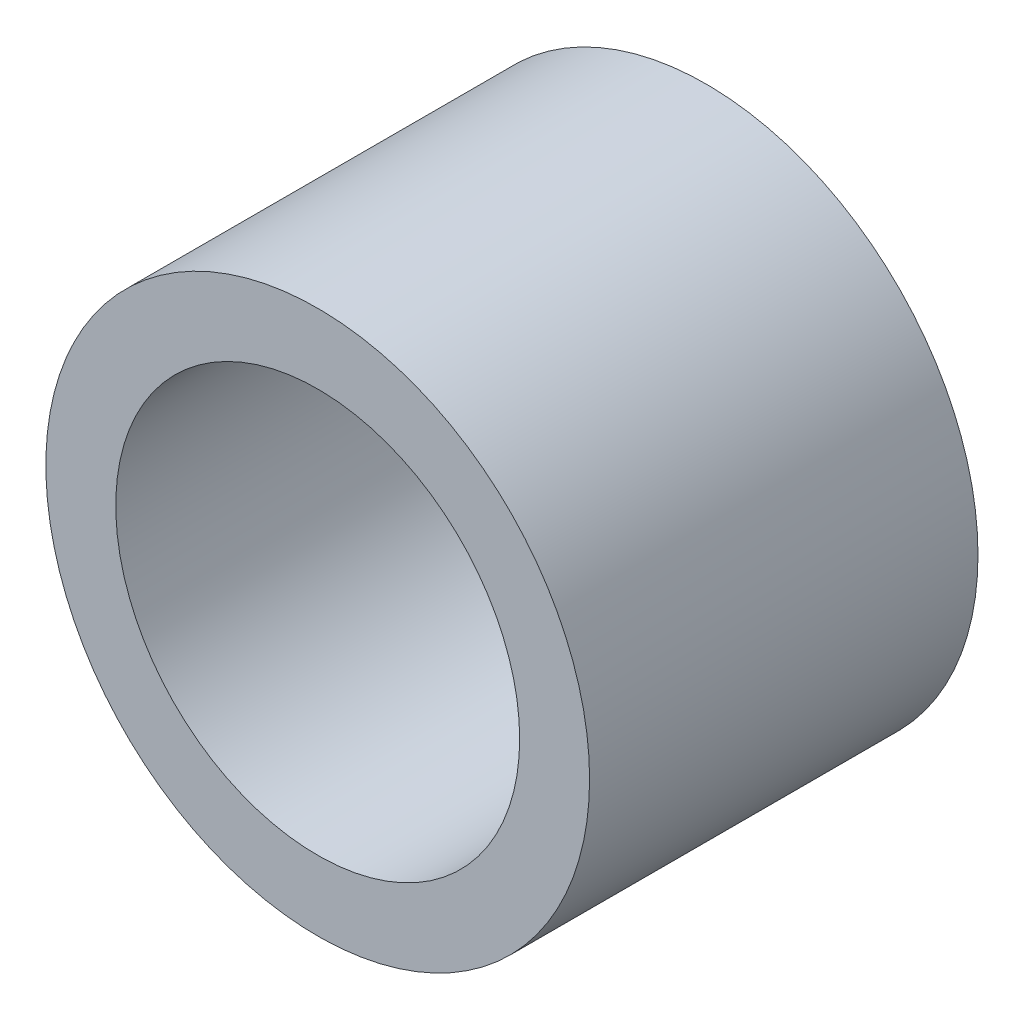
ISO-10303-21;
HEADER;
FILE_DESCRIPTION(('STEP AP214'),'2;1');
FILE_NAME('part.step','',(''),(''),'','','');
FILE_SCHEMA(('AUTOMOTIVE_DESIGN { 1 0 10303 214 1 1 1 1 }'));
ENDSEC;
DATA;
#1=APPLICATION_CONTEXT('core data for automotive mechanical design processes');
#2=APPLICATION_PROTOCOL_DEFINITION('international standard','automotive_design',2000,#1);
#3=PRODUCT_CONTEXT('',#1,'mechanical');
#4=PRODUCT('Part','Part','',(#3));
#5=PRODUCT_RELATED_PRODUCT_CATEGORY('part','',(#4));
#6=PRODUCT_DEFINITION_FORMATION('','',#4);
#7=PRODUCT_DEFINITION_CONTEXT('part definition',#1,'design');
#8=PRODUCT_DEFINITION('design','',#6,#7);
#9=PRODUCT_DEFINITION_SHAPE('','',#8);
#10=(LENGTH_UNIT() NAMED_UNIT(*) SI_UNIT(.MILLI.,.METRE.));
#11=(NAMED_UNIT(*) PLANE_ANGLE_UNIT() SI_UNIT($,.RADIAN.));
#12=(NAMED_UNIT(*) SI_UNIT($,.STERADIAN.) SOLID_ANGLE_UNIT());
#13=UNCERTAINTY_MEASURE_WITH_UNIT(LENGTH_MEASURE(1.E-05),#10,'distance_accuracy_value','');
#14=(GEOMETRIC_REPRESENTATION_CONTEXT(3) GLOBAL_UNCERTAINTY_ASSIGNED_CONTEXT((#13)) GLOBAL_UNIT_ASSIGNED_CONTEXT((#10,
#11,#12)) REPRESENTATION_CONTEXT('',''));
#15=CARTESIAN_POINT('',(0.,0.,0.));
#16=DIRECTION('',(0.,0.,1.));
#17=DIRECTION('',(1.,0.,0.));
#18=AXIS2_PLACEMENT_3D('',#15,#16,#17);
#19=CARTESIAN_POINT('',(0.,0.,10.));
#20=DIRECTION('',(0.,0.,1.));
#21=DIRECTION('',(1.,0.,0.));
#22=AXIS2_PLACEMENT_3D('',#19,#20,#21);
#23=PLANE('',#22);
#24=CARTESIAN_POINT('',(0.,0.,10.));
#25=DIRECTION('',(0.,0.,1.));
#26=DIRECTION('',(1.,0.,0.));
#27=AXIS2_PLACEMENT_3D('',#24,#25,#26);
#28=CIRCLE('',#27,7.);
#29=CARTESIAN_POINT('',(7.,0.,10.));
#30=VERTEX_POINT('',#29);
#31=EDGE_CURVE('E10',#30,#30,#28,.T.);
#32=ORIENTED_EDGE('',*,*,#31,.T.);
#33=EDGE_LOOP('',(#32));
#34=FACE_BOUND('',#33,.T.);
#35=CARTESIAN_POINT('',(0.,0.,10.));
#36=DIRECTION('',(0.,0.,1.));
#37=DIRECTION('',(1.,0.,0.));
#38=AXIS2_PLACEMENT_3D('',#35,#36,#37);
#39=CIRCLE('',#38,5.2);
#40=CARTESIAN_POINT('',(5.2,0.,10.));
#41=VERTEX_POINT('',#40);
#42=EDGE_CURVE('E42',#41,#41,#39,.T.);
#43=ORIENTED_EDGE('',*,*,#42,.F.);
#44=EDGE_LOOP('',(#43));
#45=FACE_BOUND('',#44,.T.);
#46=ADVANCED_FACE('F31',(#34,#45),#23,.T.);
#47=CARTESIAN_POINT('',(0.,0.,0.));
#48=DIRECTION('',(0.,0.,1.));
#49=DIRECTION('',(1.,0.,0.));
#50=AXIS2_PLACEMENT_3D('',#47,#48,#49);
#51=PLANE('',#50);
#52=CARTESIAN_POINT('',(0.,0.,0.));
#53=DIRECTION('',(0.,0.,1.));
#54=DIRECTION('',(1.,0.,0.));
#55=AXIS2_PLACEMENT_3D('',#52,#53,#54);
#56=CIRCLE('',#55,7.);
#57=CARTESIAN_POINT('',(7.,0.,0.));
#58=VERTEX_POINT('',#57);
#59=EDGE_CURVE('E35',#58,#58,#56,.T.);
#60=ORIENTED_EDGE('',*,*,#59,.F.);
#61=EDGE_LOOP('',(#60));
#62=FACE_BOUND('',#61,.T.);
#63=CARTESIAN_POINT('',(0.,0.,0.));
#64=DIRECTION('',(0.,0.,1.));
#65=DIRECTION('',(1.,0.,0.));
#66=AXIS2_PLACEMENT_3D('',#63,#64,#65);
#67=CIRCLE('',#66,5.2);
#68=CARTESIAN_POINT('',(5.2,0.,0.));
#69=VERTEX_POINT('',#68);
#70=EDGE_CURVE('E44',#69,#69,#67,.T.);
#71=ORIENTED_EDGE('',*,*,#70,.T.);
#72=EDGE_LOOP('',(#71));
#73=FACE_BOUND('',#72,.T.);
#74=ADVANCED_FACE('F54',(#62,#73),#51,.F.);
#75=CARTESIAN_POINT('',(0.,0.,10.));
#76=DIRECTION('',(0.,0.,-1.));
#77=DIRECTION('',(-1.,0.,0.));
#78=AXIS2_PLACEMENT_3D('',#75,#76,#77);
#79=CYLINDRICAL_SURFACE('',#78,7.);
#80=ORIENTED_EDGE('',*,*,#31,.F.);
#81=EDGE_LOOP('',(#80));
#82=FACE_BOUND('',#81,.T.);
#83=ORIENTED_EDGE('',*,*,#59,.T.);
#84=EDGE_LOOP('',(#83));
#85=FACE_BOUND('',#84,.T.);
#86=ADVANCED_FACE('F33',(#82,#85),#79,.T.);
#87=CARTESIAN_POINT('',(0.,0.,10.));
#88=DIRECTION('',(0.,0.,-1.));
#89=DIRECTION('',(-1.,0.,0.));
#90=AXIS2_PLACEMENT_3D('',#87,#88,#89);
#91=CYLINDRICAL_SURFACE('',#90,5.2);
#92=ORIENTED_EDGE('',*,*,#42,.T.);
#93=EDGE_LOOP('',(#92));
#94=FACE_BOUND('',#93,.T.);
#95=ORIENTED_EDGE('',*,*,#70,.F.);
#96=EDGE_LOOP('',(#95));
#97=FACE_BOUND('',#96,.T.);
#98=ADVANCED_FACE('F50',(#94,#97),#91,.F.);
#99=CLOSED_SHELL('',(#46,#74,#86,#98));
#100=MANIFOLD_SOLID_BREP('B2',#99);
#101=ADVANCED_BREP_SHAPE_REPRESENTATION('',(#18,#100),#14);
#102=SHAPE_DEFINITION_REPRESENTATION(#9,#101);
ENDSEC;
END-ISO-10303-21;
